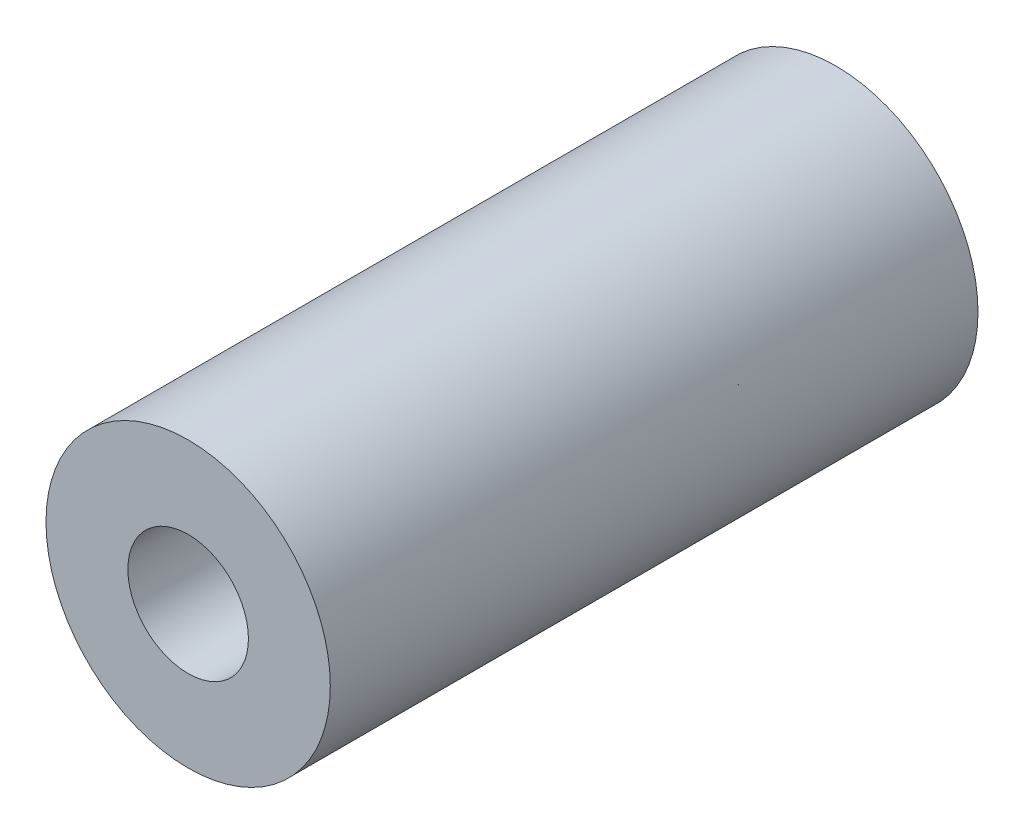
ISO-10303-21;
HEADER;
FILE_DESCRIPTION(('STEP AP214'),'2;1');
FILE_NAME('part.step','',(''),(''),'','','');
FILE_SCHEMA(('AUTOMOTIVE_DESIGN { 1 0 10303 214 1 1 1 1 }'));
ENDSEC;
DATA;
#1=APPLICATION_CONTEXT('core data for automotive mechanical design processes');
#2=APPLICATION_PROTOCOL_DEFINITION('international standard','automotive_design',2000,#1);
#3=PRODUCT_CONTEXT('',#1,'mechanical');
#4=PRODUCT('Part','Part','',(#3));
#5=PRODUCT_RELATED_PRODUCT_CATEGORY('part','',(#4));
#6=PRODUCT_DEFINITION_FORMATION('','',#4);
#7=PRODUCT_DEFINITION_CONTEXT('part definition',#1,'design');
#8=PRODUCT_DEFINITION('design','',#6,#7);
#9=PRODUCT_DEFINITION_SHAPE('','',#8);
#10=(LENGTH_UNIT() NAMED_UNIT(*) SI_UNIT(.MILLI.,.METRE.));
#11=(NAMED_UNIT(*) PLANE_ANGLE_UNIT() SI_UNIT($,.RADIAN.));
#12=(NAMED_UNIT(*) SI_UNIT($,.STERADIAN.) SOLID_ANGLE_UNIT());
#13=UNCERTAINTY_MEASURE_WITH_UNIT(LENGTH_MEASURE(1.E-05),#10,'distance_accuracy_value','');
#14=(GEOMETRIC_REPRESENTATION_CONTEXT(3) GLOBAL_UNCERTAINTY_ASSIGNED_CONTEXT((#13)) GLOBAL_UNIT_ASSIGNED_CONTEXT((#10,
#11,#12)) REPRESENTATION_CONTEXT('',''));
#15=CARTESIAN_POINT('',(0.,0.,0.));
#16=DIRECTION('',(0.,0.,1.));
#17=DIRECTION('',(1.,0.,0.));
#18=AXIS2_PLACEMENT_3D('',#15,#16,#17);
#19=CARTESIAN_POINT('',(-9.74754656649193,97.2193677098492,17.2));
#20=DIRECTION('',(0.,0.,1.));
#21=DIRECTION('',(-1.,0.,0.));
#22=AXIS2_PLACEMENT_3D('',#19,#20,#21);
#23=PLANE('',#22);
#24=CARTESIAN_POINT('',(-211.801436577596,80.4470727795225,17.2));
#25=DIRECTION('',(0.,0.,1.));
#26=DIRECTION('',(1.,0.,0.));
#27=AXIS2_PLACEMENT_3D('',#24,#25,#26);
#28=CIRCLE('',#27,2.0193);
#29=CARTESIAN_POINT('',(-209.782136577596,80.4470727795225,17.2));
#30=VERTEX_POINT('',#29);
#31=EDGE_CURVE('E54',#30,#30,#28,.T.);
#32=ORIENTED_EDGE('',*,*,#31,.F.);
#33=EDGE_LOOP('',(#32));
#34=FACE_BOUND('',#33,.T.);
#35=CARTESIAN_POINT('',(-211.801436577596,80.4470727795225,17.2));
#36=DIRECTION('',(0.,0.,1.));
#37=DIRECTION('',(1.,0.,0.));
#38=AXIS2_PLACEMENT_3D('',#35,#36,#37);
#39=CIRCLE('',#38,4.76250000000001);
#40=CARTESIAN_POINT('',(-207.038936577596,80.4470727795225,17.2));
#41=VERTEX_POINT('',#40);
#42=EDGE_CURVE('E10',#41,#41,#39,.F.);
#43=ORIENTED_EDGE('',*,*,#42,.F.);
#44=EDGE_LOOP('',(#43));
#45=FACE_BOUND('',#44,.T.);
#46=ADVANCED_FACE('F41',(#34,#45),#23,.T.);
#47=CARTESIAN_POINT('',(-211.801436577596,80.4470727795225,-4.5));
#48=DIRECTION('',(0.,0.,-1.));
#49=DIRECTION('',(-1.,0.,0.));
#50=AXIS2_PLACEMENT_3D('',#47,#48,#49);
#51=PLANE('',#50);
#52=CARTESIAN_POINT('',(-211.801436577596,80.4470727795225,-4.5));
#53=DIRECTION('',(0.,0.,-1.));
#54=DIRECTION('',(-1.,0.,0.));
#55=AXIS2_PLACEMENT_3D('',#52,#53,#54);
#56=CIRCLE('',#55,2.0193);
#57=CARTESIAN_POINT('',(-213.820736577596,80.4470727795225,-4.5));
#58=VERTEX_POINT('',#57);
#59=EDGE_CURVE('E51',#58,#58,#56,.T.);
#60=ORIENTED_EDGE('',*,*,#59,.F.);
#61=EDGE_LOOP('',(#60));
#62=FACE_BOUND('',#61,.T.);
#63=CARTESIAN_POINT('',(-211.801436577596,80.4470727795225,-4.5));
#64=DIRECTION('',(0.,0.,-1.));
#65=DIRECTION('',(-1.,0.,0.));
#66=AXIS2_PLACEMENT_3D('',#63,#64,#65);
#67=CIRCLE('',#66,4.76250000000001);
#68=CARTESIAN_POINT('',(-216.563936577596,80.4470727795225,-4.5));
#69=VERTEX_POINT('',#68);
#70=EDGE_CURVE('E50',#69,#69,#67,.T.);
#71=ORIENTED_EDGE('',*,*,#70,.T.);
#72=EDGE_LOOP('',(#71));
#73=FACE_BOUND('',#72,.T.);
#74=ADVANCED_FACE('F62',(#62,#73),#51,.T.);
#75=CARTESIAN_POINT('',(-211.801436577596,80.4470727795225,30.6703841816037));
#76=DIRECTION('',(0.,0.,-1.));
#77=DIRECTION('',(-1.,0.,0.));
#78=AXIS2_PLACEMENT_3D('',#75,#76,#77);
#79=CYLINDRICAL_SURFACE('',#78,4.76250000000001);
#80=ORIENTED_EDGE('',*,*,#70,.F.);
#81=EDGE_LOOP('',(#80));
#82=FACE_BOUND('',#81,.T.);
#83=ORIENTED_EDGE('',*,*,#42,.T.);
#84=EDGE_LOOP('',(#83));
#85=FACE_BOUND('',#84,.T.);
#86=ADVANCED_FACE('F68',(#82,#85),#79,.T.);
#87=CARTESIAN_POINT('',(-211.801436577596,80.4470727795225,-4.5));
#88=DIRECTION('',(0.,0.,-1.));
#89=DIRECTION('',(-1.,0.,0.));
#90=AXIS2_PLACEMENT_3D('',#87,#88,#89);
#91=CYLINDRICAL_SURFACE('',#90,2.01929999999999);
#92=ORIENTED_EDGE('',*,*,#59,.T.);
#93=EDGE_LOOP('',(#92));
#94=FACE_BOUND('',#93,.T.);
#95=ORIENTED_EDGE('',*,*,#31,.T.);
#96=EDGE_LOOP('',(#95));
#97=FACE_BOUND('',#96,.T.);
#98=ADVANCED_FACE('F64',(#94,#97),#91,.F.);
#99=CLOSED_SHELL('',(#46,#74,#86,#98));
#100=MANIFOLD_SOLID_BREP('B2',#99);
#101=ADVANCED_BREP_SHAPE_REPRESENTATION('',(#18,#100),#14);
#102=SHAPE_DEFINITION_REPRESENTATION(#9,#101);
ENDSEC;
END-ISO-10303-21;
